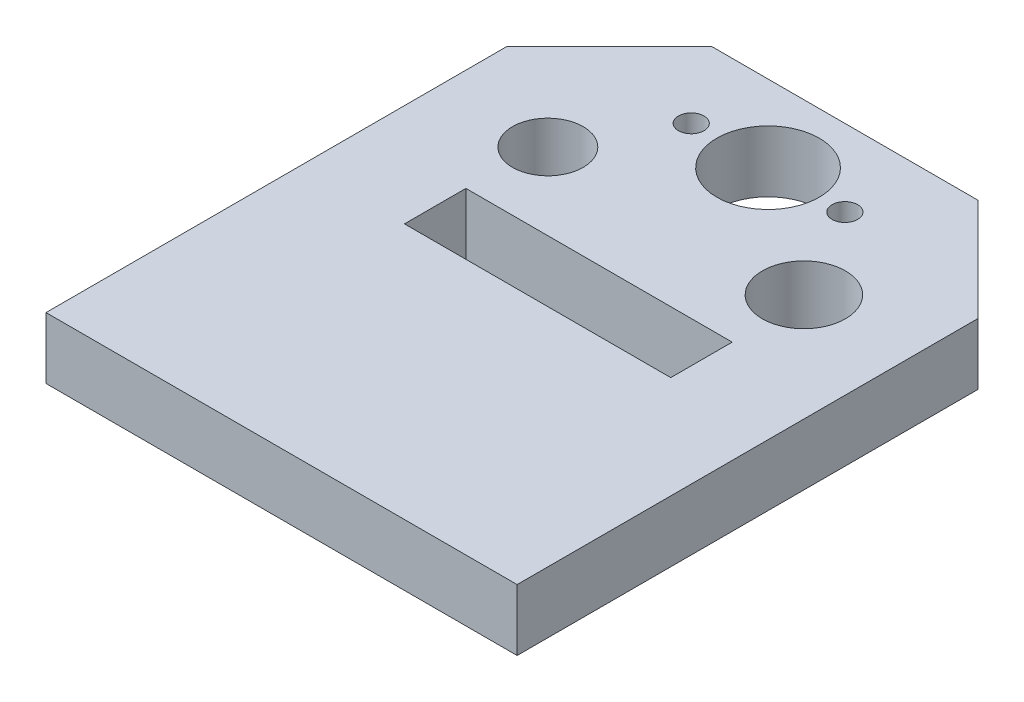
ISO-10303-21;
HEADER;
FILE_DESCRIPTION(('STEP AP214'),'2;1');
FILE_NAME('part.step','',(''),(''),'','','');
FILE_SCHEMA(('AUTOMOTIVE_DESIGN { 1 0 10303 214 1 1 1 1 }'));
ENDSEC;
DATA;
#1=APPLICATION_CONTEXT('core data for automotive mechanical design processes');
#2=APPLICATION_PROTOCOL_DEFINITION('international standard','automotive_design',2000,#1);
#3=PRODUCT_CONTEXT('',#1,'mechanical');
#4=PRODUCT('Part','Part','',(#3));
#5=PRODUCT_RELATED_PRODUCT_CATEGORY('part','',(#4));
#6=PRODUCT_DEFINITION_FORMATION('','',#4);
#7=PRODUCT_DEFINITION_CONTEXT('part definition',#1,'design');
#8=PRODUCT_DEFINITION('design','',#6,#7);
#9=PRODUCT_DEFINITION_SHAPE('','',#8);
#10=(LENGTH_UNIT() NAMED_UNIT(*) SI_UNIT(.MILLI.,.METRE.));
#11=(NAMED_UNIT(*) PLANE_ANGLE_UNIT() SI_UNIT($,.RADIAN.));
#12=(NAMED_UNIT(*) SI_UNIT($,.STERADIAN.) SOLID_ANGLE_UNIT());
#13=UNCERTAINTY_MEASURE_WITH_UNIT(LENGTH_MEASURE(1.E-05),#10,'distance_accuracy_value','');
#14=(GEOMETRIC_REPRESENTATION_CONTEXT(3) GLOBAL_UNCERTAINTY_ASSIGNED_CONTEXT((#13)) GLOBAL_UNIT_ASSIGNED_CONTEXT((#10,
#11,#12)) REPRESENTATION_CONTEXT('',''));
#15=CARTESIAN_POINT('',(0.,0.,0.));
#16=DIRECTION('',(0.,0.,1.));
#17=DIRECTION('',(1.,0.,0.));
#18=AXIS2_PLACEMENT_3D('',#15,#16,#17);
#19=CARTESIAN_POINT('',(46.,12.,-55.));
#20=DIRECTION('',(-1.,0.,0.));
#21=DIRECTION('',(0.,0.,1.));
#22=AXIS2_PLACEMENT_3D('',#19,#20,#21);
#23=PLANE('',#22);
#24=DIRECTION('',(0.,0.,-1.));
#25=VECTOR('',#24,1.);
#26=CARTESIAN_POINT('',(46.,0.,-55.));
#27=LINE('',#26,#25);
#28=CARTESIAN_POINT('',(46.,0.,55.));
#29=VERTEX_POINT('',#28);
#30=CARTESIAN_POINT('',(46.,0.,-34.9999999999999));
#31=VERTEX_POINT('',#30);
#32=EDGE_CURVE('E186',#29,#31,#27,.T.);
#33=ORIENTED_EDGE('',*,*,#32,.T.);
#34=DIRECTION('',(0.,1.,0.));
#35=VECTOR('',#34,1.);
#36=CARTESIAN_POINT('',(46.,12.,-34.9999999999999));
#37=LINE('',#36,#35);
#38=CARTESIAN_POINT('',(46.,12.,-35.));
#39=VERTEX_POINT('',#38);
#40=EDGE_CURVE('E56',#31,#39,#37,.T.);
#41=ORIENTED_EDGE('',*,*,#40,.T.);
#42=DIRECTION('',(0.,0.,-1.));
#43=VECTOR('',#42,1.);
#44=CARTESIAN_POINT('',(46.,12.,-55.));
#45=LINE('',#44,#43);
#46=CARTESIAN_POINT('',(46.,12.,55.));
#47=VERTEX_POINT('',#46);
#48=EDGE_CURVE('E187',#47,#39,#45,.T.);
#49=ORIENTED_EDGE('',*,*,#48,.F.);
#50=DIRECTION('',(0.,-1.,0.));
#51=VECTOR('',#50,1.);
#52=CARTESIAN_POINT('',(46.,12.,55.));
#53=LINE('',#52,#51);
#54=EDGE_CURVE('E196',#47,#29,#53,.T.);
#55=ORIENTED_EDGE('',*,*,#54,.T.);
#56=EDGE_LOOP('',(#33,#41,#49,#55));
#57=FACE_BOUND('',#56,.T.);
#58=ADVANCED_FACE('F33',(#57),#23,.F.);
#59=CARTESIAN_POINT('',(-46.,12.,-55.));
#60=DIRECTION('',(0.,0.,1.));
#61=DIRECTION('',(1.,0.,0.));
#62=AXIS2_PLACEMENT_3D('',#59,#60,#61);
#63=PLANE('',#62);
#64=DIRECTION('',(-1.,0.,0.));
#65=VECTOR('',#64,1.);
#66=CARTESIAN_POINT('',(-46.,12.,-55.));
#67=LINE('',#66,#65);
#68=CARTESIAN_POINT('',(26.,12.,-55.));
#69=VERTEX_POINT('',#68);
#70=CARTESIAN_POINT('',(-25.9999999999999,12.,-55.));
#71=VERTEX_POINT('',#70);
#72=EDGE_CURVE('E189',#69,#71,#67,.T.);
#73=ORIENTED_EDGE('',*,*,#72,.F.);
#74=DIRECTION('',(0.,-1.,0.));
#75=VECTOR('',#74,1.);
#76=CARTESIAN_POINT('',(26.,12.,-55.));
#77=LINE('',#76,#75);
#78=CARTESIAN_POINT('',(26.,0.,-55.));
#79=VERTEX_POINT('',#78);
#80=EDGE_CURVE('E211',#69,#79,#77,.T.);
#81=ORIENTED_EDGE('',*,*,#80,.T.);
#82=DIRECTION('',(-1.,0.,0.));
#83=VECTOR('',#82,1.);
#84=CARTESIAN_POINT('',(-46.,0.,-55.));
#85=LINE('',#84,#83);
#86=CARTESIAN_POINT('',(-25.9999999999999,0.,-55.));
#87=VERTEX_POINT('',#86);
#88=EDGE_CURVE('E198',#79,#87,#85,.T.);
#89=ORIENTED_EDGE('',*,*,#88,.T.);
#90=DIRECTION('',(0.,1.,0.));
#91=VECTOR('',#90,1.);
#92=CARTESIAN_POINT('',(-25.9999999999999,12.,-55.));
#93=LINE('',#92,#91);
#94=EDGE_CURVE('E209',#87,#71,#93,.T.);
#95=ORIENTED_EDGE('',*,*,#94,.T.);
#96=EDGE_LOOP('',(#73,#81,#89,#95));
#97=FACE_BOUND('',#96,.T.);
#98=ADVANCED_FACE('F225',(#97),#63,.F.);
#99=CARTESIAN_POINT('',(-46.,12.,-55.));
#100=DIRECTION('',(1.,0.,0.));
#101=DIRECTION('',(0.,0.,-1.));
#102=AXIS2_PLACEMENT_3D('',#99,#100,#101);
#103=PLANE('',#102);
#104=DIRECTION('',(0.,0.,1.));
#105=VECTOR('',#104,1.);
#106=CARTESIAN_POINT('',(-46.,12.,-55.));
#107=LINE('',#106,#105);
#108=CARTESIAN_POINT('',(-46.,12.,-35.));
#109=VERTEX_POINT('',#108);
#110=CARTESIAN_POINT('',(-46.,12.,55.));
#111=VERTEX_POINT('',#110);
#112=EDGE_CURVE('E192',#109,#111,#107,.T.);
#113=ORIENTED_EDGE('',*,*,#112,.F.);
#114=DIRECTION('',(0.,-1.,0.));
#115=VECTOR('',#114,1.);
#116=CARTESIAN_POINT('',(-46.,12.,-35.));
#117=LINE('',#116,#115);
#118=CARTESIAN_POINT('',(-46.,0.,-35.));
#119=VERTEX_POINT('',#118);
#120=EDGE_CURVE('E11',#109,#119,#117,.T.);
#121=ORIENTED_EDGE('',*,*,#120,.T.);
#122=DIRECTION('',(0.,0.,1.));
#123=VECTOR('',#122,1.);
#124=CARTESIAN_POINT('',(-46.,0.,-55.));
#125=LINE('',#124,#123);
#126=CARTESIAN_POINT('',(-46.,0.,55.));
#127=VERTEX_POINT('',#126);
#128=EDGE_CURVE('E201',#119,#127,#125,.T.);
#129=ORIENTED_EDGE('',*,*,#128,.T.);
#130=DIRECTION('',(0.,-1.,0.));
#131=VECTOR('',#130,1.);
#132=CARTESIAN_POINT('',(-46.,12.,55.));
#133=LINE('',#132,#131);
#134=EDGE_CURVE('E206',#111,#127,#133,.T.);
#135=ORIENTED_EDGE('',*,*,#134,.F.);
#136=EDGE_LOOP('',(#113,#121,#129,#135));
#137=FACE_BOUND('',#136,.T.);
#138=ADVANCED_FACE('F239',(#137),#103,.F.);
#139=CARTESIAN_POINT('',(-46.,12.,55.));
#140=DIRECTION('',(0.,0.,-1.));
#141=DIRECTION('',(-1.,0.,0.));
#142=AXIS2_PLACEMENT_3D('',#139,#140,#141);
#143=PLANE('',#142);
#144=DIRECTION('',(1.,0.,0.));
#145=VECTOR('',#144,1.);
#146=CARTESIAN_POINT('',(-46.,0.,55.));
#147=LINE('',#146,#145);
#148=EDGE_CURVE('E190',#127,#29,#147,.T.);
#149=ORIENTED_EDGE('',*,*,#148,.T.);
#150=ORIENTED_EDGE('',*,*,#54,.F.);
#151=DIRECTION('',(1.,0.,0.));
#152=VECTOR('',#151,1.);
#153=CARTESIAN_POINT('',(-46.,12.,55.));
#154=LINE('',#153,#152);
#155=EDGE_CURVE('E194',#111,#47,#154,.T.);
#156=ORIENTED_EDGE('',*,*,#155,.F.);
#157=ORIENTED_EDGE('',*,*,#134,.T.);
#158=EDGE_LOOP('',(#149,#150,#156,#157));
#159=FACE_BOUND('',#158,.T.);
#160=ADVANCED_FACE('F235',(#159),#143,.F.);
#161=CARTESIAN_POINT('',(46.,12.,55.));
#162=DIRECTION('',(0.,1.,0.));
#163=DIRECTION('',(0.,0.,1.));
#164=AXIS2_PLACEMENT_3D('',#161,#162,#163);
#165=PLANE('',#164);
#166=DIRECTION('',(0.,0.,1.));
#167=VECTOR('',#166,1.);
#168=CARTESIAN_POINT('',(-26.,12.,5.00000000000002));
#169=LINE('',#168,#167);
#170=CARTESIAN_POINT('',(-26.,12.,-6.99999999999999));
#171=VERTEX_POINT('',#170);
#172=CARTESIAN_POINT('',(-26.,12.,5.00000000000002));
#173=VERTEX_POINT('',#172);
#174=EDGE_CURVE('E120',#171,#173,#169,.T.);
#175=ORIENTED_EDGE('',*,*,#174,.F.);
#176=DIRECTION('',(-1.,0.,0.));
#177=VECTOR('',#176,1.);
#178=CARTESIAN_POINT('',(26.,12.,-6.99999999999999));
#179=LINE('',#178,#177);
#180=CARTESIAN_POINT('',(26.,12.,-6.99999999999999));
#181=VERTEX_POINT('',#180);
#182=EDGE_CURVE('E125',#181,#171,#179,.T.);
#183=ORIENTED_EDGE('',*,*,#182,.F.);
#184=DIRECTION('',(0.,0.,-1.));
#185=VECTOR('',#184,1.);
#186=CARTESIAN_POINT('',(26.,12.,5.00000000000001));
#187=LINE('',#186,#185);
#188=CARTESIAN_POINT('',(26.,12.,5.00000000000001));
#189=VERTEX_POINT('',#188);
#190=EDGE_CURVE('E148',#189,#181,#187,.T.);
#191=ORIENTED_EDGE('',*,*,#190,.F.);
#192=DIRECTION('',(1.,0.,0.));
#193=VECTOR('',#192,1.);
#194=CARTESIAN_POINT('',(26.,12.,5.00000000000001));
#195=LINE('',#194,#193);
#196=EDGE_CURVE('E141',#173,#189,#195,.T.);
#197=ORIENTED_EDGE('',*,*,#196,.F.);
#198=EDGE_LOOP('',(#175,#183,#191,#197));
#199=FACE_BOUND('',#198,.T.);
#200=CARTESIAN_POINT('',(15.,12.,-40.));
#201=DIRECTION('',(0.,1.,0.));
#202=DIRECTION('',(0.,0.,1.));
#203=AXIS2_PLACEMENT_3D('',#200,#201,#202);
#204=CIRCLE('',#203,2.5);
#205=CARTESIAN_POINT('',(15.,12.,-37.5));
#206=VERTEX_POINT('',#205);
#207=EDGE_CURVE('E133',#206,#206,#204,.T.);
#208=ORIENTED_EDGE('',*,*,#207,.F.);
#209=EDGE_LOOP('',(#208));
#210=FACE_BOUND('',#209,.T.);
#211=CARTESIAN_POINT('',(-15.,12.,-40.));
#212=DIRECTION('',(0.,1.,0.));
#213=DIRECTION('',(0.,0.,1.));
#214=AXIS2_PLACEMENT_3D('',#211,#212,#213);
#215=CIRCLE('',#214,2.5);
#216=CARTESIAN_POINT('',(-15.,12.,-37.5));
#217=VERTEX_POINT('',#216);
#218=EDGE_CURVE('E162',#217,#217,#215,.T.);
#219=ORIENTED_EDGE('',*,*,#218,.F.);
#220=EDGE_LOOP('',(#219));
#221=FACE_BOUND('',#220,.T.);
#222=CARTESIAN_POINT('',(25.,12.,-22.));
#223=DIRECTION('',(0.,1.,0.));
#224=DIRECTION('',(0.,0.,1.));
#225=AXIS2_PLACEMENT_3D('',#222,#223,#224);
#226=CIRCLE('',#225,8.115527508748);
#227=CARTESIAN_POINT('',(25.,12.,-13.884472491252));
#228=VERTEX_POINT('',#227);
#229=EDGE_CURVE('E168',#228,#228,#226,.T.);
#230=ORIENTED_EDGE('',*,*,#229,.F.);
#231=EDGE_LOOP('',(#230));
#232=FACE_BOUND('',#231,.T.);
#233=CARTESIAN_POINT('',(-25.,12.,-22.));
#234=DIRECTION('',(0.,1.,0.));
#235=DIRECTION('',(0.,0.,1.));
#236=AXIS2_PLACEMENT_3D('',#233,#234,#235);
#237=CIRCLE('',#236,6.90231427067231);
#238=CARTESIAN_POINT('',(-25.,12.,-15.0976857293277));
#239=VERTEX_POINT('',#238);
#240=EDGE_CURVE('E174',#239,#239,#237,.T.);
#241=ORIENTED_EDGE('',*,*,#240,.F.);
#242=EDGE_LOOP('',(#241));
#243=FACE_BOUND('',#242,.T.);
#244=CARTESIAN_POINT('',(0.,12.,-40.));
#245=DIRECTION('',(0.,1.,0.));
#246=DIRECTION('',(0.,0.,1.));
#247=AXIS2_PLACEMENT_3D('',#244,#245,#246);
#248=CIRCLE('',#247,10.);
#249=CARTESIAN_POINT('',(0.,12.,-30.));
#250=VERTEX_POINT('',#249);
#251=EDGE_CURVE('E180',#250,#250,#248,.T.);
#252=ORIENTED_EDGE('',*,*,#251,.F.);
#253=EDGE_LOOP('',(#252));
#254=FACE_BOUND('',#253,.T.);
#255=ORIENTED_EDGE('',*,*,#48,.T.);
#256=DIRECTION('',(0.707106781186546,0.,0.707106781186549));
#257=VECTOR('',#256,1.);
#258=CARTESIAN_POINT('',(91.,12.,10.0000000000002));
#259=LINE('',#258,#257);
#260=EDGE_CURVE('E41',#39,#69,#259,.F.);
#261=ORIENTED_EDGE('',*,*,#260,.T.);
#262=ORIENTED_EDGE('',*,*,#72,.T.);
#263=DIRECTION('',(0.707106781186549,0.,-0.707106781186546));
#264=VECTOR('',#263,1.);
#265=CARTESIAN_POINT('',(-44.9999999999998,12.,-36.0000000000001));
#266=LINE('',#265,#264);
#267=EDGE_CURVE('E48',#71,#109,#266,.F.);
#268=ORIENTED_EDGE('',*,*,#267,.T.);
#269=ORIENTED_EDGE('',*,*,#112,.T.);
#270=ORIENTED_EDGE('',*,*,#155,.T.);
#271=EDGE_LOOP('',(#255,#261,#262,#268,#269,#270));
#272=FACE_BOUND('',#271,.T.);
#273=ADVANCED_FACE('F221',(#199,#210,#221,#232,#243,#254,#272),#165,.T.);
#274=CARTESIAN_POINT('',(46.,0.,55.));
#275=DIRECTION('',(0.,1.,0.));
#276=DIRECTION('',(0.,0.,1.));
#277=AXIS2_PLACEMENT_3D('',#274,#275,#276);
#278=PLANE('',#277);
#279=DIRECTION('',(1.,0.,0.));
#280=VECTOR('',#279,1.);
#281=CARTESIAN_POINT('',(26.,0.,-6.99999999999999));
#282=LINE('',#281,#280);
#283=CARTESIAN_POINT('',(-26.,0.,-6.99999999999999));
#284=VERTEX_POINT('',#283);
#285=CARTESIAN_POINT('',(26.,0.,-6.99999999999999));
#286=VERTEX_POINT('',#285);
#287=EDGE_CURVE('E139',#284,#286,#282,.T.);
#288=ORIENTED_EDGE('',*,*,#287,.F.);
#289=DIRECTION('',(0.,0.,-1.));
#290=VECTOR('',#289,1.);
#291=CARTESIAN_POINT('',(-26.,0.,5.00000000000002));
#292=LINE('',#291,#290);
#293=CARTESIAN_POINT('',(-26.,0.,5.00000000000002));
#294=VERTEX_POINT('',#293);
#295=EDGE_CURVE('E117',#294,#284,#292,.T.);
#296=ORIENTED_EDGE('',*,*,#295,.F.);
#297=DIRECTION('',(-1.,0.,0.));
#298=VECTOR('',#297,1.);
#299=CARTESIAN_POINT('',(26.,0.,5.00000000000001));
#300=LINE('',#299,#298);
#301=CARTESIAN_POINT('',(26.,0.,5.00000000000001));
#302=VERTEX_POINT('',#301);
#303=EDGE_CURVE('E129',#302,#294,#300,.T.);
#304=ORIENTED_EDGE('',*,*,#303,.F.);
#305=DIRECTION('',(0.,0.,1.));
#306=VECTOR('',#305,1.);
#307=CARTESIAN_POINT('',(26.,0.,5.00000000000001));
#308=LINE('',#307,#306);
#309=EDGE_CURVE('E143',#286,#302,#308,.T.);
#310=ORIENTED_EDGE('',*,*,#309,.F.);
#311=EDGE_LOOP('',(#288,#296,#304,#310));
#312=FACE_BOUND('',#311,.T.);
#313=CARTESIAN_POINT('',(15.,0.,-40.));
#314=DIRECTION('',(0.,1.,0.));
#315=DIRECTION('',(0.,0.,1.));
#316=AXIS2_PLACEMENT_3D('',#313,#314,#315);
#317=CIRCLE('',#316,2.5);
#318=CARTESIAN_POINT('',(15.,0.,-37.5));
#319=VERTEX_POINT('',#318);
#320=EDGE_CURVE('E159',#319,#319,#317,.F.);
#321=ORIENTED_EDGE('',*,*,#320,.F.);
#322=EDGE_LOOP('',(#321));
#323=FACE_BOUND('',#322,.T.);
#324=CARTESIAN_POINT('',(-15.,0.,-40.));
#325=DIRECTION('',(0.,1.,0.));
#326=DIRECTION('',(0.,0.,1.));
#327=AXIS2_PLACEMENT_3D('',#324,#325,#326);
#328=CIRCLE('',#327,2.5);
#329=CARTESIAN_POINT('',(-15.,0.,-37.5));
#330=VERTEX_POINT('',#329);
#331=EDGE_CURVE('E165',#330,#330,#328,.F.);
#332=ORIENTED_EDGE('',*,*,#331,.F.);
#333=EDGE_LOOP('',(#332));
#334=FACE_BOUND('',#333,.T.);
#335=CARTESIAN_POINT('',(25.,0.,-22.));
#336=DIRECTION('',(0.,1.,0.));
#337=DIRECTION('',(0.,0.,1.));
#338=AXIS2_PLACEMENT_3D('',#335,#336,#337);
#339=CIRCLE('',#338,8.115527508748);
#340=CARTESIAN_POINT('',(25.,0.,-13.884472491252));
#341=VERTEX_POINT('',#340);
#342=EDGE_CURVE('E171',#341,#341,#339,.F.);
#343=ORIENTED_EDGE('',*,*,#342,.F.);
#344=EDGE_LOOP('',(#343));
#345=FACE_BOUND('',#344,.T.);
#346=CARTESIAN_POINT('',(-25.,0.,-22.));
#347=DIRECTION('',(0.,1.,0.));
#348=DIRECTION('',(0.,0.,1.));
#349=AXIS2_PLACEMENT_3D('',#346,#347,#348);
#350=CIRCLE('',#349,6.90231427067231);
#351=CARTESIAN_POINT('',(-25.,0.,-15.0976857293277));
#352=VERTEX_POINT('',#351);
#353=EDGE_CURVE('E177',#352,#352,#350,.F.);
#354=ORIENTED_EDGE('',*,*,#353,.F.);
#355=EDGE_LOOP('',(#354));
#356=FACE_BOUND('',#355,.T.);
#357=CARTESIAN_POINT('',(0.,0.,-40.));
#358=DIRECTION('',(0.,1.,0.));
#359=DIRECTION('',(0.,0.,1.));
#360=AXIS2_PLACEMENT_3D('',#357,#358,#359);
#361=CIRCLE('',#360,10.);
#362=CARTESIAN_POINT('',(0.,0.,-30.));
#363=VERTEX_POINT('',#362);
#364=EDGE_CURVE('E183',#363,#363,#361,.F.);
#365=ORIENTED_EDGE('',*,*,#364,.F.);
#366=EDGE_LOOP('',(#365));
#367=FACE_BOUND('',#366,.T.);
#368=ORIENTED_EDGE('',*,*,#88,.F.);
#369=DIRECTION('',(-0.707106781186546,0.,-0.707106781186549));
#370=VECTOR('',#369,1.);
#371=CARTESIAN_POINT('',(26.,0.,-55.));
#372=LINE('',#371,#370);
#373=EDGE_CURVE('E216',#79,#31,#372,.F.);
#374=ORIENTED_EDGE('',*,*,#373,.T.);
#375=ORIENTED_EDGE('',*,*,#32,.F.);
#376=ORIENTED_EDGE('',*,*,#148,.F.);
#377=ORIENTED_EDGE('',*,*,#128,.F.);
#378=DIRECTION('',(-0.707106781186549,0.,0.707106781186546));
#379=VECTOR('',#378,1.);
#380=CARTESIAN_POINT('',(-46.,0.,-35.));
#381=LINE('',#380,#379);
#382=EDGE_CURVE('E214',#119,#87,#381,.F.);
#383=ORIENTED_EDGE('',*,*,#382,.T.);
#384=EDGE_LOOP('',(#368,#374,#375,#376,#377,#383));
#385=FACE_BOUND('',#384,.T.);
#386=ADVANCED_FACE('F136',(#312,#323,#334,#345,#356,#367,#385),#278,.F.);
#387=CARTESIAN_POINT('',(0.,-0.000999999999999265,-40.));
#388=DIRECTION('',(0.,1.,0.));
#389=DIRECTION('',(0.,0.,1.));
#390=AXIS2_PLACEMENT_3D('',#387,#388,#389);
#391=CYLINDRICAL_SURFACE('',#390,10.);
#392=ORIENTED_EDGE('',*,*,#251,.T.);
#393=EDGE_LOOP('',(#392));
#394=FACE_BOUND('',#393,.T.);
#395=ORIENTED_EDGE('',*,*,#364,.T.);
#396=EDGE_LOOP('',(#395));
#397=FACE_BOUND('',#396,.T.);
#398=ADVANCED_FACE('F260',(#394,#397),#391,.F.);
#399=CARTESIAN_POINT('',(-25.,-0.000999999999999265,-22.));
#400=DIRECTION('',(0.,1.,0.));
#401=DIRECTION('',(0.,0.,1.));
#402=AXIS2_PLACEMENT_3D('',#399,#400,#401);
#403=CYLINDRICAL_SURFACE('',#402,6.90231427067231);
#404=ORIENTED_EDGE('',*,*,#240,.T.);
#405=EDGE_LOOP('',(#404));
#406=FACE_BOUND('',#405,.T.);
#407=ORIENTED_EDGE('',*,*,#353,.T.);
#408=EDGE_LOOP('',(#407));
#409=FACE_BOUND('',#408,.T.);
#410=ADVANCED_FACE('F266',(#406,#409),#403,.F.);
#411=CARTESIAN_POINT('',(25.,-0.000999999999999265,-22.));
#412=DIRECTION('',(0.,1.,0.));
#413=DIRECTION('',(0.,0.,1.));
#414=AXIS2_PLACEMENT_3D('',#411,#412,#413);
#415=CYLINDRICAL_SURFACE('',#414,8.115527508748);
#416=ORIENTED_EDGE('',*,*,#229,.T.);
#417=EDGE_LOOP('',(#416));
#418=FACE_BOUND('',#417,.T.);
#419=ORIENTED_EDGE('',*,*,#342,.T.);
#420=EDGE_LOOP('',(#419));
#421=FACE_BOUND('',#420,.T.);
#422=ADVANCED_FACE('F270',(#418,#421),#415,.F.);
#423=CARTESIAN_POINT('',(-15.,-0.000999999999999265,-40.));
#424=DIRECTION('',(0.,1.,0.));
#425=DIRECTION('',(0.,0.,1.));
#426=AXIS2_PLACEMENT_3D('',#423,#424,#425);
#427=CYLINDRICAL_SURFACE('',#426,2.5);
#428=ORIENTED_EDGE('',*,*,#218,.T.);
#429=EDGE_LOOP('',(#428));
#430=FACE_BOUND('',#429,.T.);
#431=ORIENTED_EDGE('',*,*,#331,.T.);
#432=EDGE_LOOP('',(#431));
#433=FACE_BOUND('',#432,.T.);
#434=ADVANCED_FACE('F274',(#430,#433),#427,.F.);
#435=CARTESIAN_POINT('',(15.,-0.000999999999999265,-40.));
#436=DIRECTION('',(0.,1.,0.));
#437=DIRECTION('',(0.,0.,1.));
#438=AXIS2_PLACEMENT_3D('',#435,#436,#437);
#439=CYLINDRICAL_SURFACE('',#438,2.5);
#440=ORIENTED_EDGE('',*,*,#207,.T.);
#441=EDGE_LOOP('',(#440));
#442=FACE_BOUND('',#441,.T.);
#443=ORIENTED_EDGE('',*,*,#320,.T.);
#444=EDGE_LOOP('',(#443));
#445=FACE_BOUND('',#444,.T.);
#446=ADVANCED_FACE('F278',(#442,#445),#439,.F.);
#447=CARTESIAN_POINT('',(-26.,-0.000999999999999265,5.00000000000002));
#448=DIRECTION('',(-1.,0.,0.));
#449=DIRECTION('',(0.,0.,1.));
#450=AXIS2_PLACEMENT_3D('',#447,#448,#449);
#451=PLANE('',#450);
#452=ORIENTED_EDGE('',*,*,#295,.T.);
#453=DIRECTION('',(0.,1.,0.));
#454=VECTOR('',#453,1.);
#455=CARTESIAN_POINT('',(-26.,-0.000999999999999265,-6.99999999999999));
#456=LINE('',#455,#454);
#457=EDGE_CURVE('E134',#284,#171,#456,.T.);
#458=ORIENTED_EDGE('',*,*,#457,.T.);
#459=ORIENTED_EDGE('',*,*,#174,.T.);
#460=DIRECTION('',(0.,1.,0.));
#461=VECTOR('',#460,1.);
#462=CARTESIAN_POINT('',(-26.,-0.000999999999999265,5.00000000000002));
#463=LINE('',#462,#461);
#464=EDGE_CURVE('E113',#294,#173,#463,.T.);
#465=ORIENTED_EDGE('',*,*,#464,.F.);
#466=EDGE_LOOP('',(#452,#458,#459,#465));
#467=FACE_BOUND('',#466,.T.);
#468=ADVANCED_FACE('F115',(#467),#451,.F.);
#469=CARTESIAN_POINT('',(26.,-0.000999999999999265,-6.99999999999999));
#470=DIRECTION('',(0.,0.,-1.));
#471=DIRECTION('',(-1.,0.,0.));
#472=AXIS2_PLACEMENT_3D('',#469,#470,#471);
#473=PLANE('',#472);
#474=ORIENTED_EDGE('',*,*,#287,.T.);
#475=DIRECTION('',(0.,1.,0.));
#476=VECTOR('',#475,1.);
#477=CARTESIAN_POINT('',(26.,-0.000999999999999265,-6.99999999999999));
#478=LINE('',#477,#476);
#479=EDGE_CURVE('E154',#286,#181,#478,.T.);
#480=ORIENTED_EDGE('',*,*,#479,.T.);
#481=ORIENTED_EDGE('',*,*,#182,.T.);
#482=ORIENTED_EDGE('',*,*,#457,.F.);
#483=EDGE_LOOP('',(#474,#480,#481,#482));
#484=FACE_BOUND('',#483,.T.);
#485=ADVANCED_FACE('F285',(#484),#473,.F.);
#486=CARTESIAN_POINT('',(26.,-0.000999999999999265,5.00000000000001));
#487=DIRECTION('',(1.,0.,0.));
#488=DIRECTION('',(0.,0.,-1.));
#489=AXIS2_PLACEMENT_3D('',#486,#487,#488);
#490=PLANE('',#489);
#491=ORIENTED_EDGE('',*,*,#309,.T.);
#492=DIRECTION('',(0.,1.,0.));
#493=VECTOR('',#492,1.);
#494=CARTESIAN_POINT('',(26.,-0.000999999999999265,5.00000000000001));
#495=LINE('',#494,#493);
#496=EDGE_CURVE('E124',#302,#189,#495,.T.);
#497=ORIENTED_EDGE('',*,*,#496,.T.);
#498=ORIENTED_EDGE('',*,*,#190,.T.);
#499=ORIENTED_EDGE('',*,*,#479,.F.);
#500=EDGE_LOOP('',(#491,#497,#498,#499));
#501=FACE_BOUND('',#500,.T.);
#502=ADVANCED_FACE('F288',(#501),#490,.F.);
#503=CARTESIAN_POINT('',(26.,-0.000999999999999265,5.00000000000001));
#504=DIRECTION('',(0.,0.,1.));
#505=DIRECTION('',(1.,0.,0.));
#506=AXIS2_PLACEMENT_3D('',#503,#504,#505);
#507=PLANE('',#506);
#508=ORIENTED_EDGE('',*,*,#303,.T.);
#509=ORIENTED_EDGE('',*,*,#464,.T.);
#510=ORIENTED_EDGE('',*,*,#196,.T.);
#511=ORIENTED_EDGE('',*,*,#496,.F.);
#512=EDGE_LOOP('',(#508,#509,#510,#511));
#513=FACE_BOUND('',#512,.T.);
#514=ADVANCED_FACE('F130',(#513),#507,.F.);
#515=CARTESIAN_POINT('',(26.,12.,-55.));
#516=DIRECTION('',(-0.707106781186549,0.,0.707106781186546));
#517=DIRECTION('',(0.707106781186546,0.,0.707106781186549));
#518=AXIS2_PLACEMENT_3D('',#515,#516,#517);
#519=PLANE('',#518);
#520=ORIENTED_EDGE('',*,*,#260,.F.);
#521=ORIENTED_EDGE('',*,*,#40,.F.);
#522=ORIENTED_EDGE('',*,*,#373,.F.);
#523=ORIENTED_EDGE('',*,*,#80,.F.);
#524=EDGE_LOOP('',(#520,#521,#522,#523));
#525=FACE_BOUND('',#524,.T.);
#526=ADVANCED_FACE('F228',(#525),#519,.F.);
#527=CARTESIAN_POINT('',(-46.,12.,-35.));
#528=DIRECTION('',(0.707106781186546,0.,0.707106781186549));
#529=DIRECTION('',(0.707106781186549,0.,-0.707106781186546));
#530=AXIS2_PLACEMENT_3D('',#527,#528,#529);
#531=PLANE('',#530);
#532=ORIENTED_EDGE('',*,*,#267,.F.);
#533=ORIENTED_EDGE('',*,*,#94,.F.);
#534=ORIENTED_EDGE('',*,*,#382,.F.);
#535=ORIENTED_EDGE('',*,*,#120,.F.);
#536=EDGE_LOOP('',(#532,#533,#534,#535));
#537=FACE_BOUND('',#536,.T.);
#538=ADVANCED_FACE('F35',(#537),#531,.F.);
#539=CLOSED_SHELL('',(#58,#98,#138,#160,#273,#386,#398,#410,#422,#434,#446,#468,#485,#502,#514,
#526,#538));
#540=MANIFOLD_SOLID_BREP('B2',#539);
#541=ADVANCED_BREP_SHAPE_REPRESENTATION('',(#18,#540),#14);
#542=SHAPE_DEFINITION_REPRESENTATION(#9,#541);
ENDSEC;
END-ISO-10303-21;
